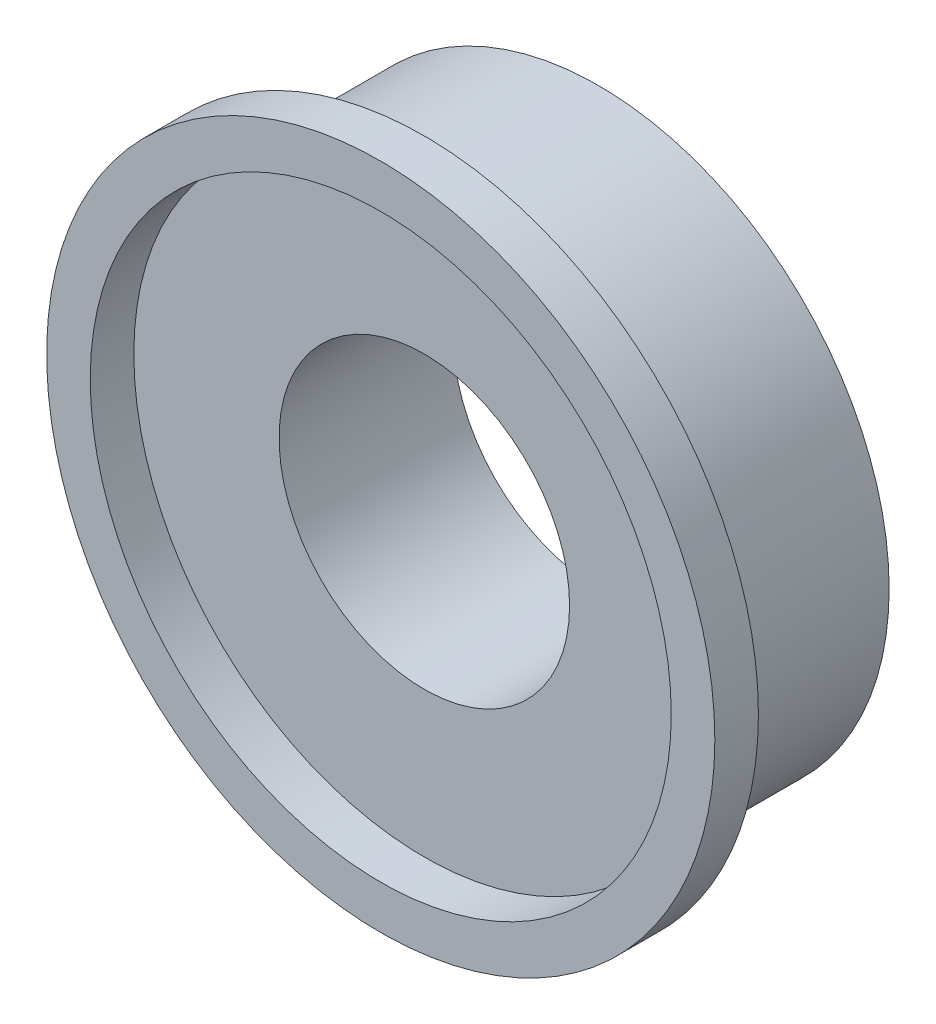
ISO-10303-21;
HEADER;
FILE_DESCRIPTION(('STEP AP214'),'2;1');
FILE_NAME('part.step','',(''),(''),'','','');
FILE_SCHEMA(('AUTOMOTIVE_DESIGN { 1 0 10303 214 1 1 1 1 }'));
ENDSEC;
DATA;
#1=APPLICATION_CONTEXT('core data for automotive mechanical design processes');
#2=APPLICATION_PROTOCOL_DEFINITION('international standard','automotive_design',2000,#1);
#3=PRODUCT_CONTEXT('',#1,'mechanical');
#4=PRODUCT('Part','Part','',(#3));
#5=PRODUCT_RELATED_PRODUCT_CATEGORY('part','',(#4));
#6=PRODUCT_DEFINITION_FORMATION('','',#4);
#7=PRODUCT_DEFINITION_CONTEXT('part definition',#1,'design');
#8=PRODUCT_DEFINITION('design','',#6,#7);
#9=PRODUCT_DEFINITION_SHAPE('','',#8);
#10=(LENGTH_UNIT() NAMED_UNIT(*) SI_UNIT(.MILLI.,.METRE.));
#11=(NAMED_UNIT(*) PLANE_ANGLE_UNIT() SI_UNIT($,.RADIAN.));
#12=(NAMED_UNIT(*) SI_UNIT($,.STERADIAN.) SOLID_ANGLE_UNIT());
#13=UNCERTAINTY_MEASURE_WITH_UNIT(LENGTH_MEASURE(1.E-05),#10,'distance_accuracy_value','');
#14=(GEOMETRIC_REPRESENTATION_CONTEXT(3) GLOBAL_UNCERTAINTY_ASSIGNED_CONTEXT((#13)) GLOBAL_UNIT_ASSIGNED_CONTEXT((#10,
#11,#12)) REPRESENTATION_CONTEXT('',''));
#15=CARTESIAN_POINT('',(0.,0.,0.));
#16=DIRECTION('',(0.,0.,1.));
#17=DIRECTION('',(1.,0.,0.));
#18=AXIS2_PLACEMENT_3D('',#15,#16,#17);
#19=CARTESIAN_POINT('',(0.,0.,3.));
#20=DIRECTION('',(0.,0.,1.));
#21=DIRECTION('',(1.,0.,0.));
#22=AXIS2_PLACEMENT_3D('',#19,#20,#21);
#23=PLANE('',#22);
#24=CARTESIAN_POINT('',(0.,0.,3.));
#25=DIRECTION('',(0.,0.,1.));
#26=DIRECTION('',(1.,0.,0.));
#27=AXIS2_PLACEMENT_3D('',#24,#25,#26);
#28=CIRCLE('',#27,4.6);
#29=CARTESIAN_POINT('',(4.6,0.,3.));
#30=VERTEX_POINT('',#29);
#31=EDGE_CURVE('E11',#30,#30,#28,.T.);
#32=ORIENTED_EDGE('',*,*,#31,.T.);
#33=EDGE_LOOP('',(#32));
#34=FACE_BOUND('',#33,.T.);
#35=CARTESIAN_POINT('',(0.,0.,3.));
#36=DIRECTION('',(0.,0.,1.));
#37=DIRECTION('',(1.,0.,0.));
#38=AXIS2_PLACEMENT_3D('',#35,#36,#37);
#39=CIRCLE('',#38,4.);
#40=CARTESIAN_POINT('',(4.,0.,3.));
#41=VERTEX_POINT('',#40);
#42=EDGE_CURVE('E51',#41,#41,#39,.T.);
#43=ORIENTED_EDGE('',*,*,#42,.F.);
#44=EDGE_LOOP('',(#43));
#45=FACE_BOUND('',#44,.T.);
#46=ADVANCED_FACE('F40',(#34,#45),#23,.T.);
#47=CARTESIAN_POINT('',(0.,0.,2.4));
#48=DIRECTION('',(0.,0.,1.));
#49=DIRECTION('',(1.,0.,0.));
#50=AXIS2_PLACEMENT_3D('',#47,#48,#49);
#51=PLANE('',#50);
#52=CARTESIAN_POINT('',(0.,0.,2.4));
#53=DIRECTION('',(0.,0.,1.));
#54=DIRECTION('',(1.,0.,0.));
#55=AXIS2_PLACEMENT_3D('',#52,#53,#54);
#56=CIRCLE('',#55,4.6);
#57=CARTESIAN_POINT('',(4.6,0.,2.4));
#58=VERTEX_POINT('',#57);
#59=EDGE_CURVE('E44',#58,#58,#56,.T.);
#60=ORIENTED_EDGE('',*,*,#59,.F.);
#61=EDGE_LOOP('',(#60));
#62=FACE_BOUND('',#61,.T.);
#63=CARTESIAN_POINT('',(0.,0.,2.4));
#64=DIRECTION('',(0.,0.,1.));
#65=DIRECTION('',(1.,0.,0.));
#66=AXIS2_PLACEMENT_3D('',#63,#64,#65);
#67=CIRCLE('',#66,4.);
#68=CARTESIAN_POINT('',(4.,0.,2.4));
#69=VERTEX_POINT('',#68);
#70=EDGE_CURVE('E53',#69,#69,#67,.T.);
#71=ORIENTED_EDGE('',*,*,#70,.T.);
#72=EDGE_LOOP('',(#71));
#73=FACE_BOUND('',#72,.T.);
#74=ADVANCED_FACE('F63',(#62,#73),#51,.F.);
#75=CARTESIAN_POINT('',(0.,0.,3.));
#76=DIRECTION('',(0.,0.,-1.));
#77=DIRECTION('',(-1.,0.,0.));
#78=AXIS2_PLACEMENT_3D('',#75,#76,#77);
#79=CYLINDRICAL_SURFACE('',#78,4.6);
#80=ORIENTED_EDGE('',*,*,#31,.F.);
#81=EDGE_LOOP('',(#80));
#82=FACE_BOUND('',#81,.T.);
#83=ORIENTED_EDGE('',*,*,#59,.T.);
#84=EDGE_LOOP('',(#83));
#85=FACE_BOUND('',#84,.T.);
#86=ADVANCED_FACE('F42',(#82,#85),#79,.T.);
#87=CARTESIAN_POINT('',(0.,0.,3.));
#88=DIRECTION('',(0.,0.,-1.));
#89=DIRECTION('',(-1.,0.,0.));
#90=AXIS2_PLACEMENT_3D('',#87,#88,#89);
#91=CYLINDRICAL_SURFACE('',#90,4.);
#92=ORIENTED_EDGE('',*,*,#42,.T.);
#93=EDGE_LOOP('',(#92));
#94=FACE_BOUND('',#93,.T.);
#95=ORIENTED_EDGE('',*,*,#70,.F.);
#96=EDGE_LOOP('',(#95));
#97=FACE_BOUND('',#96,.T.);
#98=ADVANCED_FACE('F59',(#94,#97),#91,.F.);
#99=CLOSED_SHELL('',(#46,#74,#86,#98));
#100=MANIFOLD_SOLID_BREP('B2',#99);
#101=CARTESIAN_POINT('',(0.,0.,2.4));
#102=DIRECTION('',(0.,0.,1.));
#103=DIRECTION('',(1.,0.,0.));
#104=AXIS2_PLACEMENT_3D('',#101,#102,#103);
#105=PLANE('',#104);
#106=CARTESIAN_POINT('',(0.,0.,2.4));
#107=DIRECTION('',(0.,0.,1.));
#108=DIRECTION('',(1.,0.,0.));
#109=AXIS2_PLACEMENT_3D('',#106,#107,#108);
#110=CIRCLE('',#109,4.);
#111=CARTESIAN_POINT('',(4.,0.,2.4));
#112=VERTEX_POINT('',#111);
#113=EDGE_CURVE('E39',#112,#112,#110,.T.);
#114=ORIENTED_EDGE('',*,*,#113,.T.);
#115=EDGE_LOOP('',(#114));
#116=FACE_BOUND('',#115,.T.);
#117=CARTESIAN_POINT('',(0.,0.,2.4));
#118=DIRECTION('',(0.,0.,1.));
#119=DIRECTION('',(1.,0.,0.));
#120=AXIS2_PLACEMENT_3D('',#117,#118,#119);
#121=CIRCLE('',#120,2.);
#122=CARTESIAN_POINT('',(2.,0.,2.4));
#123=VERTEX_POINT('',#122);
#124=EDGE_CURVE('E112',#123,#123,#121,.T.);
#125=ORIENTED_EDGE('',*,*,#124,.F.);
#126=EDGE_LOOP('',(#125));
#127=FACE_BOUND('',#126,.T.);
#128=ADVANCED_FACE('F101',(#116,#127),#105,.T.);
#129=CARTESIAN_POINT('',(0.,0.,0.));
#130=DIRECTION('',(0.,0.,1.));
#131=DIRECTION('',(1.,0.,0.));
#132=AXIS2_PLACEMENT_3D('',#129,#130,#131);
#133=PLANE('',#132);
#134=CARTESIAN_POINT('',(0.,0.,0.));
#135=DIRECTION('',(0.,0.,1.));
#136=DIRECTION('',(1.,0.,0.));
#137=AXIS2_PLACEMENT_3D('',#134,#135,#136);
#138=CIRCLE('',#137,4.);
#139=CARTESIAN_POINT('',(4.,0.,0.));
#140=VERTEX_POINT('',#139);
#141=EDGE_CURVE('E105',#140,#140,#138,.T.);
#142=ORIENTED_EDGE('',*,*,#141,.F.);
#143=EDGE_LOOP('',(#142));
#144=FACE_BOUND('',#143,.T.);
#145=CARTESIAN_POINT('',(0.,0.,0.));
#146=DIRECTION('',(0.,0.,1.));
#147=DIRECTION('',(1.,0.,0.));
#148=AXIS2_PLACEMENT_3D('',#145,#146,#147);
#149=CIRCLE('',#148,2.);
#150=CARTESIAN_POINT('',(2.,0.,0.));
#151=VERTEX_POINT('',#150);
#152=EDGE_CURVE('E114',#151,#151,#149,.T.);
#153=ORIENTED_EDGE('',*,*,#152,.T.);
#154=EDGE_LOOP('',(#153));
#155=FACE_BOUND('',#154,.T.);
#156=ADVANCED_FACE('F124',(#144,#155),#133,.F.);
#157=CARTESIAN_POINT('',(0.,0.,2.4));
#158=DIRECTION('',(0.,0.,-1.));
#159=DIRECTION('',(-1.,0.,0.));
#160=AXIS2_PLACEMENT_3D('',#157,#158,#159);
#161=CYLINDRICAL_SURFACE('',#160,4.);
#162=ORIENTED_EDGE('',*,*,#113,.F.);
#163=EDGE_LOOP('',(#162));
#164=FACE_BOUND('',#163,.T.);
#165=ORIENTED_EDGE('',*,*,#141,.T.);
#166=EDGE_LOOP('',(#165));
#167=FACE_BOUND('',#166,.T.);
#168=ADVANCED_FACE('F103',(#164,#167),#161,.T.);
#169=CARTESIAN_POINT('',(0.,0.,2.4));
#170=DIRECTION('',(0.,0.,-1.));
#171=DIRECTION('',(-1.,0.,0.));
#172=AXIS2_PLACEMENT_3D('',#169,#170,#171);
#173=CYLINDRICAL_SURFACE('',#172,2.);
#174=ORIENTED_EDGE('',*,*,#124,.T.);
#175=EDGE_LOOP('',(#174));
#176=FACE_BOUND('',#175,.T.);
#177=ORIENTED_EDGE('',*,*,#152,.F.);
#178=EDGE_LOOP('',(#177));
#179=FACE_BOUND('',#178,.T.);
#180=ADVANCED_FACE('F120',(#176,#179),#173,.F.);
#181=CLOSED_SHELL('',(#128,#156,#168,#180));
#182=MANIFOLD_SOLID_BREP('B6',#181);
#183=ADVANCED_BREP_SHAPE_REPRESENTATION('',(#18,#100,#182),#14);
#184=SHAPE_DEFINITION_REPRESENTATION(#9,#183);
ENDSEC;
END-ISO-10303-21;
